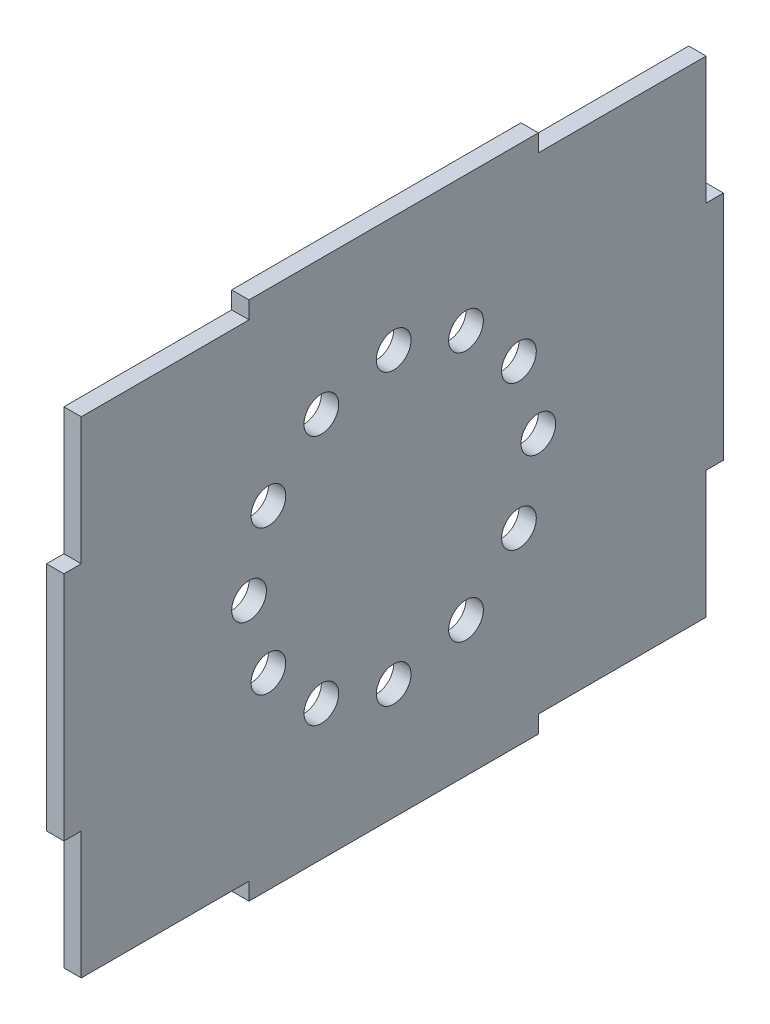
ISO-10303-21;
HEADER;
FILE_DESCRIPTION(('STEP AP214'),'2;1');
FILE_NAME('part.step','',(''),(''),'','','');
FILE_SCHEMA(('AUTOMOTIVE_DESIGN { 1 0 10303 214 1 1 1 1 }'));
ENDSEC;
DATA;
#1=APPLICATION_CONTEXT('core data for automotive mechanical design processes');
#2=APPLICATION_PROTOCOL_DEFINITION('international standard','automotive_design',2000,#1);
#3=PRODUCT_CONTEXT('',#1,'mechanical');
#4=PRODUCT('Part','Part','',(#3));
#5=PRODUCT_RELATED_PRODUCT_CATEGORY('part','',(#4));
#6=PRODUCT_DEFINITION_FORMATION('','',#4);
#7=PRODUCT_DEFINITION_CONTEXT('part definition',#1,'design');
#8=PRODUCT_DEFINITION('design','',#6,#7);
#9=PRODUCT_DEFINITION_SHAPE('','',#8);
#10=(LENGTH_UNIT() NAMED_UNIT(*) SI_UNIT(.MILLI.,.METRE.));
#11=(NAMED_UNIT(*) PLANE_ANGLE_UNIT() SI_UNIT($,.RADIAN.));
#12=(NAMED_UNIT(*) SI_UNIT($,.STERADIAN.) SOLID_ANGLE_UNIT());
#13=UNCERTAINTY_MEASURE_WITH_UNIT(LENGTH_MEASURE(1.E-05),#10,'distance_accuracy_value','');
#14=(GEOMETRIC_REPRESENTATION_CONTEXT(3) GLOBAL_UNCERTAINTY_ASSIGNED_CONTEXT((#13)) GLOBAL_UNIT_ASSIGNED_CONTEXT((#10,
#11,#12)) REPRESENTATION_CONTEXT('',''));
#15=CARTESIAN_POINT('',(0.,0.,0.));
#16=DIRECTION('',(0.,0.,1.));
#17=DIRECTION('',(1.,0.,0.));
#18=AXIS2_PLACEMENT_3D('',#15,#16,#17);
#19=CARTESIAN_POINT('',(3.,3.00000000000002,-82.));
#20=DIRECTION('',(0.,0.,1.));
#21=DIRECTION('',(1.,0.,0.));
#22=AXIS2_PLACEMENT_3D('',#19,#20,#21);
#23=PLANE('',#22);
#24=DIRECTION('',(0.,1.,0.));
#25=VECTOR('',#24,1.);
#26=CARTESIAN_POINT('',(0.,3.00000000000002,-82.));
#27=LINE('',#26,#25);
#28=CARTESIAN_POINT('',(0.,0.,-82.));
#29=VERTEX_POINT('',#28);
#30=CARTESIAN_POINT('',(0.,3.00000000000002,-82.));
#31=VERTEX_POINT('',#30);
#32=EDGE_CURVE('E203',#29,#31,#27,.T.);
#33=ORIENTED_EDGE('',*,*,#32,.T.);
#34=DIRECTION('',(-1.,0.,0.));
#35=VECTOR('',#34,1.);
#36=CARTESIAN_POINT('',(3.,3.00000000000002,-82.));
#37=LINE('',#36,#35);
#38=CARTESIAN_POINT('',(3.,3.00000000000002,-82.));
#39=VERTEX_POINT('',#38);
#40=EDGE_CURVE('E11',#39,#31,#37,.T.);
#41=ORIENTED_EDGE('',*,*,#40,.F.);
#42=DIRECTION('',(0.,1.,0.));
#43=VECTOR('',#42,1.);
#44=CARTESIAN_POINT('',(3.,3.00000000000002,-82.));
#45=LINE('',#44,#43);
#46=CARTESIAN_POINT('',(3.,0.,-82.));
#47=VERTEX_POINT('',#46);
#48=EDGE_CURVE('E242',#47,#39,#45,.T.);
#49=ORIENTED_EDGE('',*,*,#48,.F.);
#50=DIRECTION('',(-1.,0.,0.));
#51=VECTOR('',#50,1.);
#52=CARTESIAN_POINT('',(3.,0.,-82.));
#53=LINE('',#52,#51);
#54=EDGE_CURVE('E199',#47,#29,#53,.T.);
#55=ORIENTED_EDGE('',*,*,#54,.T.);
#56=EDGE_LOOP('',(#33,#41,#49,#55));
#57=FACE_BOUND('',#56,.T.);
#58=ADVANCED_FACE('F35',(#57),#23,.F.);
#59=CARTESIAN_POINT('',(3.,3.00000000000001,-111.));
#60=DIRECTION('',(0.,1.,0.));
#61=DIRECTION('',(0.,0.,1.));
#62=AXIS2_PLACEMENT_3D('',#59,#60,#61);
#63=PLANE('',#62);
#64=DIRECTION('',(0.,0.,-1.));
#65=VECTOR('',#64,1.);
#66=CARTESIAN_POINT('',(0.,3.00000000000001,-111.));
#67=LINE('',#66,#65);
#68=CARTESIAN_POINT('',(0.,3.00000000000001,-111.));
#69=VERTEX_POINT('',#68);
#70=EDGE_CURVE('E206',#31,#69,#67,.T.);
#71=ORIENTED_EDGE('',*,*,#70,.T.);
#72=DIRECTION('',(-1.,0.,0.));
#73=VECTOR('',#72,1.);
#74=CARTESIAN_POINT('',(3.,3.00000000000001,-111.));
#75=LINE('',#74,#73);
#76=CARTESIAN_POINT('',(3.,3.00000000000001,-111.));
#77=VERTEX_POINT('',#76);
#78=EDGE_CURVE('E43',#77,#69,#75,.T.);
#79=ORIENTED_EDGE('',*,*,#78,.F.);
#80=DIRECTION('',(0.,0.,-1.));
#81=VECTOR('',#80,1.);
#82=CARTESIAN_POINT('',(3.,3.00000000000001,-111.));
#83=LINE('',#82,#81);
#84=EDGE_CURVE('E130',#39,#77,#83,.T.);
#85=ORIENTED_EDGE('',*,*,#84,.F.);
#86=ORIENTED_EDGE('',*,*,#40,.T.);
#87=EDGE_LOOP('',(#71,#79,#85,#86));
#88=FACE_BOUND('',#87,.T.);
#89=ADVANCED_FACE('F361',(#88),#63,.F.);
#90=CARTESIAN_POINT('',(3.,25.,-111.));
#91=DIRECTION('',(0.,0.,1.));
#92=DIRECTION('',(1.,0.,0.));
#93=AXIS2_PLACEMENT_3D('',#90,#91,#92);
#94=PLANE('',#93);
#95=DIRECTION('',(0.,1.,0.));
#96=VECTOR('',#95,1.);
#97=CARTESIAN_POINT('',(0.,25.,-111.));
#98=LINE('',#97,#96);
#99=CARTESIAN_POINT('',(0.,25.,-111.));
#100=VERTEX_POINT('',#99);
#101=EDGE_CURVE('E209',#69,#100,#98,.T.);
#102=ORIENTED_EDGE('',*,*,#101,.T.);
#103=DIRECTION('',(-1.,0.,0.));
#104=VECTOR('',#103,1.);
#105=CARTESIAN_POINT('',(3.,25.,-111.));
#106=LINE('',#105,#104);
#107=CARTESIAN_POINT('',(3.,25.,-111.));
#108=VERTEX_POINT('',#107);
#109=EDGE_CURVE('E285',#108,#100,#106,.T.);
#110=ORIENTED_EDGE('',*,*,#109,.F.);
#111=DIRECTION('',(0.,1.,0.));
#112=VECTOR('',#111,1.);
#113=CARTESIAN_POINT('',(3.,25.,-111.));
#114=LINE('',#113,#112);
#115=EDGE_CURVE('E293',#77,#108,#114,.T.);
#116=ORIENTED_EDGE('',*,*,#115,.F.);
#117=ORIENTED_EDGE('',*,*,#78,.T.);
#118=EDGE_LOOP('',(#102,#110,#116,#117));
#119=FACE_BOUND('',#118,.T.);
#120=ADVANCED_FACE('F291',(#119),#94,.F.);
#121=CARTESIAN_POINT('',(3.,25.,-114.));
#122=DIRECTION('',(0.,1.,0.));
#123=DIRECTION('',(0.,0.,1.));
#124=AXIS2_PLACEMENT_3D('',#121,#122,#123);
#125=PLANE('',#124);
#126=DIRECTION('',(0.,0.,-1.));
#127=VECTOR('',#126,1.);
#128=CARTESIAN_POINT('',(0.,25.,-114.));
#129=LINE('',#128,#127);
#130=CARTESIAN_POINT('',(0.,25.,-114.));
#131=VERTEX_POINT('',#130);
#132=EDGE_CURVE('E211',#100,#131,#129,.T.);
#133=ORIENTED_EDGE('',*,*,#132,.T.);
#134=DIRECTION('',(-1.,0.,0.));
#135=VECTOR('',#134,1.);
#136=CARTESIAN_POINT('',(3.,25.,-114.));
#137=LINE('',#136,#135);
#138=CARTESIAN_POINT('',(3.,25.,-114.));
#139=VERTEX_POINT('',#138);
#140=EDGE_CURVE('E282',#139,#131,#137,.T.);
#141=ORIENTED_EDGE('',*,*,#140,.F.);
#142=DIRECTION('',(0.,0.,-1.));
#143=VECTOR('',#142,1.);
#144=CARTESIAN_POINT('',(3.,25.,-114.));
#145=LINE('',#144,#143);
#146=EDGE_CURVE('E311',#108,#139,#145,.T.);
#147=ORIENTED_EDGE('',*,*,#146,.F.);
#148=ORIENTED_EDGE('',*,*,#109,.T.);
#149=EDGE_LOOP('',(#133,#141,#147,#148));
#150=FACE_BOUND('',#149,.T.);
#151=ADVANCED_FACE('F302',(#150),#125,.F.);
#152=CARTESIAN_POINT('',(3.,65.,-114.));
#153=DIRECTION('',(0.,0.,1.));
#154=DIRECTION('',(1.,0.,0.));
#155=AXIS2_PLACEMENT_3D('',#152,#153,#154);
#156=PLANE('',#155);
#157=DIRECTION('',(0.,1.,0.));
#158=VECTOR('',#157,1.);
#159=CARTESIAN_POINT('',(0.,65.,-114.));
#160=LINE('',#159,#158);
#161=CARTESIAN_POINT('',(0.,65.,-114.));
#162=VERTEX_POINT('',#161);
#163=EDGE_CURVE('E213',#131,#162,#160,.T.);
#164=ORIENTED_EDGE('',*,*,#163,.T.);
#165=DIRECTION('',(-1.,0.,0.));
#166=VECTOR('',#165,1.);
#167=CARTESIAN_POINT('',(3.,65.,-114.));
#168=LINE('',#167,#166);
#169=CARTESIAN_POINT('',(3.,65.,-114.));
#170=VERTEX_POINT('',#169);
#171=EDGE_CURVE('E279',#170,#162,#168,.T.);
#172=ORIENTED_EDGE('',*,*,#171,.F.);
#173=DIRECTION('',(0.,1.,0.));
#174=VECTOR('',#173,1.);
#175=CARTESIAN_POINT('',(3.,65.,-114.));
#176=LINE('',#175,#174);
#177=EDGE_CURVE('E308',#139,#170,#176,.T.);
#178=ORIENTED_EDGE('',*,*,#177,.F.);
#179=ORIENTED_EDGE('',*,*,#140,.T.);
#180=EDGE_LOOP('',(#164,#172,#178,#179));
#181=FACE_BOUND('',#180,.T.);
#182=ADVANCED_FACE('F306',(#181),#156,.F.);
#183=CARTESIAN_POINT('',(3.,65.,-114.));
#184=DIRECTION('',(0.,-1.,0.));
#185=DIRECTION('',(0.,0.,-1.));
#186=AXIS2_PLACEMENT_3D('',#183,#184,#185);
#187=PLANE('',#186);
#188=DIRECTION('',(0.,0.,1.));
#189=VECTOR('',#188,1.);
#190=CARTESIAN_POINT('',(0.,65.,-114.));
#191=LINE('',#190,#189);
#192=CARTESIAN_POINT('',(0.,65.,-111.));
#193=VERTEX_POINT('',#192);
#194=EDGE_CURVE('E215',#162,#193,#191,.T.);
#195=ORIENTED_EDGE('',*,*,#194,.T.);
#196=DIRECTION('',(-1.,0.,0.));
#197=VECTOR('',#196,1.);
#198=CARTESIAN_POINT('',(3.,65.,-111.));
#199=LINE('',#198,#197);
#200=CARTESIAN_POINT('',(3.,65.,-111.));
#201=VERTEX_POINT('',#200);
#202=EDGE_CURVE('E276',#201,#193,#199,.T.);
#203=ORIENTED_EDGE('',*,*,#202,.F.);
#204=DIRECTION('',(0.,0.,1.));
#205=VECTOR('',#204,1.);
#206=CARTESIAN_POINT('',(3.,65.,-114.));
#207=LINE('',#206,#205);
#208=EDGE_CURVE('E310',#170,#201,#207,.T.);
#209=ORIENTED_EDGE('',*,*,#208,.F.);
#210=ORIENTED_EDGE('',*,*,#171,.T.);
#211=EDGE_LOOP('',(#195,#203,#209,#210));
#212=FACE_BOUND('',#211,.T.);
#213=ADVANCED_FACE('F374',(#212),#187,.F.);
#214=CARTESIAN_POINT('',(3.,65.,-111.));
#215=DIRECTION('',(0.,0.,1.));
#216=DIRECTION('',(1.,0.,0.));
#217=AXIS2_PLACEMENT_3D('',#214,#215,#216);
#218=PLANE('',#217);
#219=DIRECTION('',(0.,1.,0.));
#220=VECTOR('',#219,1.);
#221=CARTESIAN_POINT('',(0.,65.,-111.));
#222=LINE('',#221,#220);
#223=CARTESIAN_POINT('',(0.,87.,-111.));
#224=VERTEX_POINT('',#223);
#225=EDGE_CURVE('E217',#193,#224,#222,.T.);
#226=ORIENTED_EDGE('',*,*,#225,.T.);
#227=DIRECTION('',(-1.,0.,0.));
#228=VECTOR('',#227,1.);
#229=CARTESIAN_POINT('',(3.,87.,-111.));
#230=LINE('',#229,#228);
#231=CARTESIAN_POINT('',(3.,87.,-111.));
#232=VERTEX_POINT('',#231);
#233=EDGE_CURVE('E273',#232,#224,#230,.T.);
#234=ORIENTED_EDGE('',*,*,#233,.F.);
#235=DIRECTION('',(0.,1.,0.));
#236=VECTOR('',#235,1.);
#237=CARTESIAN_POINT('',(3.,65.,-111.));
#238=LINE('',#237,#236);
#239=EDGE_CURVE('E313',#201,#232,#238,.T.);
#240=ORIENTED_EDGE('',*,*,#239,.F.);
#241=ORIENTED_EDGE('',*,*,#202,.T.);
#242=EDGE_LOOP('',(#226,#234,#240,#241));
#243=FACE_BOUND('',#242,.T.);
#244=ADVANCED_FACE('F377',(#243),#218,.F.);
#245=CARTESIAN_POINT('',(3.,87.,-111.));
#246=DIRECTION('',(0.,-1.,0.));
#247=DIRECTION('',(0.,0.,-1.));
#248=AXIS2_PLACEMENT_3D('',#245,#246,#247);
#249=PLANE('',#248);
#250=DIRECTION('',(0.,0.,1.));
#251=VECTOR('',#250,1.);
#252=CARTESIAN_POINT('',(0.,87.,-111.));
#253=LINE('',#252,#251);
#254=CARTESIAN_POINT('',(0.,87.,-82.));
#255=VERTEX_POINT('',#254);
#256=EDGE_CURVE('E219',#224,#255,#253,.T.);
#257=ORIENTED_EDGE('',*,*,#256,.T.);
#258=DIRECTION('',(-1.,0.,0.));
#259=VECTOR('',#258,1.);
#260=CARTESIAN_POINT('',(3.,87.,-82.));
#261=LINE('',#260,#259);
#262=CARTESIAN_POINT('',(3.,87.,-82.));
#263=VERTEX_POINT('',#262);
#264=EDGE_CURVE('E270',#263,#255,#261,.T.);
#265=ORIENTED_EDGE('',*,*,#264,.F.);
#266=DIRECTION('',(0.,0.,1.));
#267=VECTOR('',#266,1.);
#268=CARTESIAN_POINT('',(3.,87.,-111.));
#269=LINE('',#268,#267);
#270=EDGE_CURVE('E319',#232,#263,#269,.T.);
#271=ORIENTED_EDGE('',*,*,#270,.F.);
#272=ORIENTED_EDGE('',*,*,#233,.T.);
#273=EDGE_LOOP('',(#257,#265,#271,#272));
#274=FACE_BOUND('',#273,.T.);
#275=ADVANCED_FACE('F381',(#274),#249,.F.);
#276=CARTESIAN_POINT('',(3.,87.,-82.));
#277=DIRECTION('',(0.,0.,1.));
#278=DIRECTION('',(1.,0.,0.));
#279=AXIS2_PLACEMENT_3D('',#276,#277,#278);
#280=PLANE('',#279);
#281=DIRECTION('',(0.,1.,0.));
#282=VECTOR('',#281,1.);
#283=CARTESIAN_POINT('',(0.,87.,-82.));
#284=LINE('',#283,#282);
#285=CARTESIAN_POINT('',(0.,90.,-82.));
#286=VERTEX_POINT('',#285);
#287=EDGE_CURVE('E221',#255,#286,#284,.T.);
#288=ORIENTED_EDGE('',*,*,#287,.T.);
#289=DIRECTION('',(-1.,0.,0.));
#290=VECTOR('',#289,1.);
#291=CARTESIAN_POINT('',(3.,90.,-82.));
#292=LINE('',#291,#290);
#293=CARTESIAN_POINT('',(3.,90.,-82.));
#294=VERTEX_POINT('',#293);
#295=EDGE_CURVE('E267',#294,#286,#292,.T.);
#296=ORIENTED_EDGE('',*,*,#295,.F.);
#297=DIRECTION('',(0.,1.,0.));
#298=VECTOR('',#297,1.);
#299=CARTESIAN_POINT('',(3.,87.,-82.));
#300=LINE('',#299,#298);
#301=EDGE_CURVE('E321',#263,#294,#300,.T.);
#302=ORIENTED_EDGE('',*,*,#301,.F.);
#303=ORIENTED_EDGE('',*,*,#264,.T.);
#304=EDGE_LOOP('',(#288,#296,#302,#303));
#305=FACE_BOUND('',#304,.T.);
#306=ADVANCED_FACE('F385',(#305),#280,.F.);
#307=CARTESIAN_POINT('',(3.,89.9999999999999,-32.));
#308=DIRECTION('',(0.,-1.,0.));
#309=DIRECTION('',(0.,0.,-1.));
#310=AXIS2_PLACEMENT_3D('',#307,#308,#309);
#311=PLANE('',#310);
#312=DIRECTION('',(0.,0.,1.));
#313=VECTOR('',#312,1.);
#314=CARTESIAN_POINT('',(0.,89.9999999999999,-32.));
#315=LINE('',#314,#313);
#316=CARTESIAN_POINT('',(0.,89.9999999999999,-32.));
#317=VERTEX_POINT('',#316);
#318=EDGE_CURVE('E223',#286,#317,#315,.T.);
#319=ORIENTED_EDGE('',*,*,#318,.T.);
#320=DIRECTION('',(-1.,0.,0.));
#321=VECTOR('',#320,1.);
#322=CARTESIAN_POINT('',(3.,89.9999999999999,-32.));
#323=LINE('',#322,#321);
#324=CARTESIAN_POINT('',(3.,89.9999999999999,-32.));
#325=VERTEX_POINT('',#324);
#326=EDGE_CURVE('E264',#325,#317,#323,.T.);
#327=ORIENTED_EDGE('',*,*,#326,.F.);
#328=DIRECTION('',(0.,0.,1.));
#329=VECTOR('',#328,1.);
#330=CARTESIAN_POINT('',(3.,89.9999999999999,-32.));
#331=LINE('',#330,#329);
#332=EDGE_CURVE('E323',#294,#325,#331,.T.);
#333=ORIENTED_EDGE('',*,*,#332,.F.);
#334=ORIENTED_EDGE('',*,*,#295,.T.);
#335=EDGE_LOOP('',(#319,#327,#333,#334));
#336=FACE_BOUND('',#335,.T.);
#337=ADVANCED_FACE('F389',(#336),#311,.F.);
#338=CARTESIAN_POINT('',(3.,87.,-32.));
#339=DIRECTION('',(0.,0.,-1.));
#340=DIRECTION('',(0.,1.,0.));
#341=AXIS2_PLACEMENT_3D('',#338,#339,#340);
#342=PLANE('',#341);
#343=DIRECTION('',(0.,-1.,0.));
#344=VECTOR('',#343,1.);
#345=CARTESIAN_POINT('',(0.,87.,-32.));
#346=LINE('',#345,#344);
#347=CARTESIAN_POINT('',(0.,87.,-32.));
#348=VERTEX_POINT('',#347);
#349=EDGE_CURVE('E225',#317,#348,#346,.T.);
#350=ORIENTED_EDGE('',*,*,#349,.T.);
#351=DIRECTION('',(-1.,0.,0.));
#352=VECTOR('',#351,1.);
#353=CARTESIAN_POINT('',(3.,87.,-32.));
#354=LINE('',#353,#352);
#355=CARTESIAN_POINT('',(3.,87.,-32.));
#356=VERTEX_POINT('',#355);
#357=EDGE_CURVE('E261',#356,#348,#354,.T.);
#358=ORIENTED_EDGE('',*,*,#357,.F.);
#359=DIRECTION('',(0.,-1.,0.));
#360=VECTOR('',#359,1.);
#361=CARTESIAN_POINT('',(3.,87.,-32.));
#362=LINE('',#361,#360);
#363=EDGE_CURVE('E325',#325,#356,#362,.T.);
#364=ORIENTED_EDGE('',*,*,#363,.F.);
#365=ORIENTED_EDGE('',*,*,#326,.T.);
#366=EDGE_LOOP('',(#350,#358,#364,#365));
#367=FACE_BOUND('',#366,.T.);
#368=ADVANCED_FACE('F393',(#367),#342,.F.);
#369=CARTESIAN_POINT('',(3.,87.,-2.99999999999999));
#370=DIRECTION('',(0.,-1.,0.));
#371=DIRECTION('',(0.,0.,-1.));
#372=AXIS2_PLACEMENT_3D('',#369,#370,#371);
#373=PLANE('',#372);
#374=DIRECTION('',(0.,0.,1.));
#375=VECTOR('',#374,1.);
#376=CARTESIAN_POINT('',(0.,87.,-2.99999999999999));
#377=LINE('',#376,#375);
#378=CARTESIAN_POINT('',(0.,87.,-2.99999999999999));
#379=VERTEX_POINT('',#378);
#380=EDGE_CURVE('E227',#348,#379,#377,.T.);
#381=ORIENTED_EDGE('',*,*,#380,.T.);
#382=DIRECTION('',(-1.,0.,0.));
#383=VECTOR('',#382,1.);
#384=CARTESIAN_POINT('',(3.,87.,-2.99999999999999));
#385=LINE('',#384,#383);
#386=CARTESIAN_POINT('',(3.,87.,-2.99999999999999));
#387=VERTEX_POINT('',#386);
#388=EDGE_CURVE('E258',#387,#379,#385,.T.);
#389=ORIENTED_EDGE('',*,*,#388,.F.);
#390=DIRECTION('',(0.,0.,1.));
#391=VECTOR('',#390,1.);
#392=CARTESIAN_POINT('',(3.,87.,-2.99999999999999));
#393=LINE('',#392,#391);
#394=EDGE_CURVE('E327',#356,#387,#393,.T.);
#395=ORIENTED_EDGE('',*,*,#394,.F.);
#396=ORIENTED_EDGE('',*,*,#357,.T.);
#397=EDGE_LOOP('',(#381,#389,#395,#396));
#398=FACE_BOUND('',#397,.T.);
#399=ADVANCED_FACE('F397',(#398),#373,.F.);
#400=CARTESIAN_POINT('',(3.,65.,-2.99999999999999));
#401=DIRECTION('',(0.,0.,-1.));
#402=DIRECTION('',(-1.,0.,0.));
#403=AXIS2_PLACEMENT_3D('',#400,#401,#402);
#404=PLANE('',#403);
#405=DIRECTION('',(0.,-1.,0.));
#406=VECTOR('',#405,1.);
#407=CARTESIAN_POINT('',(0.,65.,-2.99999999999999));
#408=LINE('',#407,#406);
#409=CARTESIAN_POINT('',(0.,65.,-2.99999999999999));
#410=VERTEX_POINT('',#409);
#411=EDGE_CURVE('E229',#379,#410,#408,.T.);
#412=ORIENTED_EDGE('',*,*,#411,.T.);
#413=DIRECTION('',(-1.,0.,0.));
#414=VECTOR('',#413,1.);
#415=CARTESIAN_POINT('',(3.,65.,-2.99999999999999));
#416=LINE('',#415,#414);
#417=CARTESIAN_POINT('',(3.,65.,-2.99999999999999));
#418=VERTEX_POINT('',#417);
#419=EDGE_CURVE('E255',#418,#410,#416,.T.);
#420=ORIENTED_EDGE('',*,*,#419,.F.);
#421=DIRECTION('',(0.,-1.,0.));
#422=VECTOR('',#421,1.);
#423=CARTESIAN_POINT('',(3.,65.,-2.99999999999999));
#424=LINE('',#423,#422);
#425=EDGE_CURVE('E329',#387,#418,#424,.T.);
#426=ORIENTED_EDGE('',*,*,#425,.F.);
#427=ORIENTED_EDGE('',*,*,#388,.T.);
#428=EDGE_LOOP('',(#412,#420,#426,#427));
#429=FACE_BOUND('',#428,.T.);
#430=ADVANCED_FACE('F401',(#429),#404,.F.);
#431=CARTESIAN_POINT('',(3.,65.,0.));
#432=DIRECTION('',(0.,-1.,0.));
#433=DIRECTION('',(0.,0.,-1.));
#434=AXIS2_PLACEMENT_3D('',#431,#432,#433);
#435=PLANE('',#434);
#436=DIRECTION('',(0.,0.,1.));
#437=VECTOR('',#436,1.);
#438=CARTESIAN_POINT('',(0.,65.,0.));
#439=LINE('',#438,#437);
#440=CARTESIAN_POINT('',(0.,65.,0.));
#441=VERTEX_POINT('',#440);
#442=EDGE_CURVE('E231',#410,#441,#439,.T.);
#443=ORIENTED_EDGE('',*,*,#442,.T.);
#444=DIRECTION('',(-1.,0.,0.));
#445=VECTOR('',#444,1.);
#446=CARTESIAN_POINT('',(3.,65.,0.));
#447=LINE('',#446,#445);
#448=CARTESIAN_POINT('',(3.,65.,0.));
#449=VERTEX_POINT('',#448);
#450=EDGE_CURVE('E252',#449,#441,#447,.T.);
#451=ORIENTED_EDGE('',*,*,#450,.F.);
#452=DIRECTION('',(0.,0.,1.));
#453=VECTOR('',#452,1.);
#454=CARTESIAN_POINT('',(3.,65.,0.));
#455=LINE('',#454,#453);
#456=EDGE_CURVE('E331',#418,#449,#455,.T.);
#457=ORIENTED_EDGE('',*,*,#456,.F.);
#458=ORIENTED_EDGE('',*,*,#419,.T.);
#459=EDGE_LOOP('',(#443,#451,#457,#458));
#460=FACE_BOUND('',#459,.T.);
#461=ADVANCED_FACE('F405',(#460),#435,.F.);
#462=CARTESIAN_POINT('',(3.,65.,0.));
#463=DIRECTION('',(0.,0.,-1.));
#464=DIRECTION('',(0.,1.,0.));
#465=AXIS2_PLACEMENT_3D('',#462,#463,#464);
#466=PLANE('',#465);
#467=DIRECTION('',(0.,-1.,0.));
#468=VECTOR('',#467,1.);
#469=CARTESIAN_POINT('',(0.,65.,0.));
#470=LINE('',#469,#468);
#471=CARTESIAN_POINT('',(0.,25.,0.));
#472=VERTEX_POINT('',#471);
#473=EDGE_CURVE('E233',#441,#472,#470,.T.);
#474=ORIENTED_EDGE('',*,*,#473,.T.);
#475=DIRECTION('',(-1.,0.,0.));
#476=VECTOR('',#475,1.);
#477=CARTESIAN_POINT('',(3.,25.,0.));
#478=LINE('',#477,#476);
#479=CARTESIAN_POINT('',(3.,25.,0.));
#480=VERTEX_POINT('',#479);
#481=EDGE_CURVE('E249',#480,#472,#478,.T.);
#482=ORIENTED_EDGE('',*,*,#481,.F.);
#483=DIRECTION('',(0.,-1.,0.));
#484=VECTOR('',#483,1.);
#485=CARTESIAN_POINT('',(3.,65.,0.));
#486=LINE('',#485,#484);
#487=EDGE_CURVE('E333',#449,#480,#486,.T.);
#488=ORIENTED_EDGE('',*,*,#487,.F.);
#489=ORIENTED_EDGE('',*,*,#450,.T.);
#490=EDGE_LOOP('',(#474,#482,#488,#489));
#491=FACE_BOUND('',#490,.T.);
#492=ADVANCED_FACE('F409',(#491),#466,.F.);
#493=CARTESIAN_POINT('',(3.,25.,0.));
#494=DIRECTION('',(0.,1.,0.));
#495=DIRECTION('',(0.,0.,1.));
#496=AXIS2_PLACEMENT_3D('',#493,#494,#495);
#497=PLANE('',#496);
#498=DIRECTION('',(0.,0.,-1.));
#499=VECTOR('',#498,1.);
#500=CARTESIAN_POINT('',(0.,25.,0.));
#501=LINE('',#500,#499);
#502=CARTESIAN_POINT('',(0.,25.,-3.));
#503=VERTEX_POINT('',#502);
#504=EDGE_CURVE('E235',#472,#503,#501,.T.);
#505=ORIENTED_EDGE('',*,*,#504,.T.);
#506=DIRECTION('',(-1.,0.,0.));
#507=VECTOR('',#506,1.);
#508=CARTESIAN_POINT('',(3.,25.,-3.));
#509=LINE('',#508,#507);
#510=CARTESIAN_POINT('',(3.,25.,-3.));
#511=VERTEX_POINT('',#510);
#512=EDGE_CURVE('E246',#511,#503,#509,.T.);
#513=ORIENTED_EDGE('',*,*,#512,.F.);
#514=DIRECTION('',(0.,0.,-1.));
#515=VECTOR('',#514,1.);
#516=CARTESIAN_POINT('',(3.,25.,0.));
#517=LINE('',#516,#515);
#518=EDGE_CURVE('E335',#480,#511,#517,.T.);
#519=ORIENTED_EDGE('',*,*,#518,.F.);
#520=ORIENTED_EDGE('',*,*,#481,.T.);
#521=EDGE_LOOP('',(#505,#513,#519,#520));
#522=FACE_BOUND('',#521,.T.);
#523=ADVANCED_FACE('F341',(#522),#497,.F.);
#524=CARTESIAN_POINT('',(3.,25.,-3.));
#525=DIRECTION('',(0.,0.,-1.));
#526=DIRECTION('',(0.,1.,0.));
#527=AXIS2_PLACEMENT_3D('',#524,#525,#526);
#528=PLANE('',#527);
#529=DIRECTION('',(0.,-1.,0.));
#530=VECTOR('',#529,1.);
#531=CARTESIAN_POINT('',(0.,25.,-3.));
#532=LINE('',#531,#530);
#533=CARTESIAN_POINT('',(0.,3.,-3.00000000000001));
#534=VERTEX_POINT('',#533);
#535=EDGE_CURVE('E237',#503,#534,#532,.T.);
#536=ORIENTED_EDGE('',*,*,#535,.T.);
#537=DIRECTION('',(-1.,0.,0.));
#538=VECTOR('',#537,1.);
#539=CARTESIAN_POINT('',(3.,3.,-3.00000000000001));
#540=LINE('',#539,#538);
#541=CARTESIAN_POINT('',(3.,3.,-3.00000000000001));
#542=VERTEX_POINT('',#541);
#543=EDGE_CURVE('E194',#542,#534,#540,.T.);
#544=ORIENTED_EDGE('',*,*,#543,.F.);
#545=DIRECTION('',(0.,-1.,0.));
#546=VECTOR('',#545,1.);
#547=CARTESIAN_POINT('',(3.,25.,-3.));
#548=LINE('',#547,#546);
#549=EDGE_CURVE('E185',#511,#542,#548,.T.);
#550=ORIENTED_EDGE('',*,*,#549,.F.);
#551=ORIENTED_EDGE('',*,*,#512,.T.);
#552=EDGE_LOOP('',(#536,#544,#550,#551));
#553=FACE_BOUND('',#552,.T.);
#554=ADVANCED_FACE('F345',(#553),#528,.F.);
#555=CARTESIAN_POINT('',(3.,3.,-3.00000000000001));
#556=DIRECTION('',(0.,1.,0.));
#557=DIRECTION('',(0.,0.,1.));
#558=AXIS2_PLACEMENT_3D('',#555,#556,#557);
#559=PLANE('',#558);
#560=DIRECTION('',(0.,0.,-1.));
#561=VECTOR('',#560,1.);
#562=CARTESIAN_POINT('',(0.,3.,-3.00000000000001));
#563=LINE('',#562,#561);
#564=CARTESIAN_POINT('',(0.,3.00000000000002,-32.));
#565=VERTEX_POINT('',#564);
#566=EDGE_CURVE('E193',#534,#565,#563,.T.);
#567=ORIENTED_EDGE('',*,*,#566,.T.);
#568=DIRECTION('',(-1.,0.,0.));
#569=VECTOR('',#568,1.);
#570=CARTESIAN_POINT('',(3.,3.00000000000002,-32.));
#571=LINE('',#570,#569);
#572=CARTESIAN_POINT('',(3.,3.00000000000002,-32.));
#573=VERTEX_POINT('',#572);
#574=EDGE_CURVE('E190',#573,#565,#571,.T.);
#575=ORIENTED_EDGE('',*,*,#574,.F.);
#576=DIRECTION('',(0.,0.,-1.));
#577=VECTOR('',#576,1.);
#578=CARTESIAN_POINT('',(3.,3.,-3.00000000000001));
#579=LINE('',#578,#577);
#580=EDGE_CURVE('E179',#542,#573,#579,.T.);
#581=ORIENTED_EDGE('',*,*,#580,.F.);
#582=ORIENTED_EDGE('',*,*,#543,.T.);
#583=EDGE_LOOP('',(#567,#575,#581,#582));
#584=FACE_BOUND('',#583,.T.);
#585=ADVANCED_FACE('F191',(#584),#559,.F.);
#586=CARTESIAN_POINT('',(3.,3.00000000000002,-32.));
#587=DIRECTION('',(0.,0.,-1.));
#588=DIRECTION('',(-1.,0.,0.));
#589=AXIS2_PLACEMENT_3D('',#586,#587,#588);
#590=PLANE('',#589);
#591=DIRECTION('',(0.,-1.,0.));
#592=VECTOR('',#591,1.);
#593=CARTESIAN_POINT('',(0.,3.00000000000002,-32.));
#594=LINE('',#593,#592);
#595=CARTESIAN_POINT('',(0.,0.,-32.));
#596=VERTEX_POINT('',#595);
#597=EDGE_CURVE('E116',#565,#596,#594,.T.);
#598=ORIENTED_EDGE('',*,*,#597,.T.);
#599=DIRECTION('',(-1.,0.,0.));
#600=VECTOR('',#599,1.);
#601=CARTESIAN_POINT('',(3.,0.,-32.));
#602=LINE('',#601,#600);
#603=CARTESIAN_POINT('',(3.,0.,-32.));
#604=VERTEX_POINT('',#603);
#605=EDGE_CURVE('E195',#604,#596,#602,.T.);
#606=ORIENTED_EDGE('',*,*,#605,.F.);
#607=DIRECTION('',(0.,-1.,0.));
#608=VECTOR('',#607,1.);
#609=CARTESIAN_POINT('',(3.,3.00000000000002,-32.));
#610=LINE('',#609,#608);
#611=EDGE_CURVE('E183',#573,#604,#610,.T.);
#612=ORIENTED_EDGE('',*,*,#611,.F.);
#613=ORIENTED_EDGE('',*,*,#574,.T.);
#614=EDGE_LOOP('',(#598,#606,#612,#613));
#615=FACE_BOUND('',#614,.T.);
#616=ADVANCED_FACE('F197',(#615),#590,.F.);
#617=CARTESIAN_POINT('',(3.,0.,-32.));
#618=DIRECTION('',(0.,1.,0.));
#619=DIRECTION('',(0.,0.,1.));
#620=AXIS2_PLACEMENT_3D('',#617,#618,#619);
#621=PLANE('',#620);
#622=DIRECTION('',(0.,0.,-1.));
#623=VECTOR('',#622,1.);
#624=CARTESIAN_POINT('',(0.,0.,-32.));
#625=LINE('',#624,#623);
#626=EDGE_CURVE('E122',#596,#29,#625,.T.);
#627=ORIENTED_EDGE('',*,*,#626,.T.);
#628=ORIENTED_EDGE('',*,*,#54,.F.);
#629=DIRECTION('',(0.,0.,-1.));
#630=VECTOR('',#629,1.);
#631=CARTESIAN_POINT('',(3.,0.,-32.));
#632=LINE('',#631,#630);
#633=EDGE_CURVE('E51',#604,#47,#632,.T.);
#634=ORIENTED_EDGE('',*,*,#633,.F.);
#635=ORIENTED_EDGE('',*,*,#605,.T.);
#636=EDGE_LOOP('',(#627,#628,#634,#635));
#637=FACE_BOUND('',#636,.T.);
#638=ADVANCED_FACE('F349',(#637),#621,.F.);
#639=CARTESIAN_POINT('',(3.,0.,0.));
#640=DIRECTION('',(1.,0.,0.));
#641=DIRECTION('',(0.,0.,-1.));
#642=AXIS2_PLACEMENT_3D('',#639,#640,#641);
#643=PLANE('',#642);
#644=CARTESIAN_POINT('',(3.,23.3493649053889,-69.4999999999998));
#645=DIRECTION('',(1.,0.,0.));
#646=DIRECTION('',(0.,0.,-1.));
#647=AXIS2_PLACEMENT_3D('',#644,#645,#646);
#648=CIRCLE('',#647,3.00000000000001);
#649=CARTESIAN_POINT('',(3.,23.3493649053889,-72.4999999999998));
#650=VERTEX_POINT('',#649);
#651=EDGE_CURVE('E575',#650,#650,#648,.T.);
#652=ORIENTED_EDGE('',*,*,#651,.F.);
#653=EDGE_LOOP('',(#652));
#654=FACE_BOUND('',#653,.T.);
#655=CARTESIAN_POINT('',(3.,32.4999999999998,-78.6506350946109));
#656=DIRECTION('',(1.,0.,0.));
#657=DIRECTION('',(0.,0.,-1.));
#658=AXIS2_PLACEMENT_3D('',#655,#656,#657);
#659=CIRCLE('',#658,3.);
#660=CARTESIAN_POINT('',(3.,32.4999999999998,-81.6506350946109));
#661=VERTEX_POINT('',#660);
#662=EDGE_CURVE('E578',#661,#661,#659,.T.);
#663=ORIENTED_EDGE('',*,*,#662,.F.);
#664=EDGE_LOOP('',(#663));
#665=FACE_BOUND('',#664,.T.);
#666=CARTESIAN_POINT('',(3.,44.9999999999998,-82.));
#667=DIRECTION('',(1.,0.,0.));
#668=DIRECTION('',(0.,0.,-1.));
#669=AXIS2_PLACEMENT_3D('',#666,#667,#668);
#670=CIRCLE('',#669,3.00000000000002);
#671=CARTESIAN_POINT('',(3.,44.9999999999998,-85.));
#672=VERTEX_POINT('',#671);
#673=EDGE_CURVE('E637',#672,#672,#670,.T.);
#674=ORIENTED_EDGE('',*,*,#673,.F.);
#675=EDGE_LOOP('',(#674));
#676=FACE_BOUND('',#675,.T.);
#677=CARTESIAN_POINT('',(3.,57.4999999999999,-78.650635094611));
#678=DIRECTION('',(1.,0.,0.));
#679=DIRECTION('',(0.,0.,-1.));
#680=AXIS2_PLACEMENT_3D('',#677,#678,#679);
#681=CIRCLE('',#680,3.);
#682=CARTESIAN_POINT('',(3.,57.4999999999999,-81.650635094611));
#683=VERTEX_POINT('',#682);
#684=EDGE_CURVE('E624',#683,#683,#681,.T.);
#685=ORIENTED_EDGE('',*,*,#684,.F.);
#686=EDGE_LOOP('',(#685));
#687=FACE_BOUND('',#686,.T.);
#688=CARTESIAN_POINT('',(3.,66.6506350946109,-69.5000000000001));
#689=DIRECTION('',(1.,0.,0.));
#690=DIRECTION('',(0.,0.,-1.));
#691=AXIS2_PLACEMENT_3D('',#688,#689,#690);
#692=CIRCLE('',#691,3.);
#693=CARTESIAN_POINT('',(3.,66.6506350946109,-72.5000000000001));
#694=VERTEX_POINT('',#693);
#695=EDGE_CURVE('E607',#694,#694,#692,.T.);
#696=ORIENTED_EDGE('',*,*,#695,.F.);
#697=EDGE_LOOP('',(#696));
#698=FACE_BOUND('',#697,.T.);
#699=CARTESIAN_POINT('',(3.,70.,-57.0000000000001));
#700=DIRECTION('',(1.,0.,0.));
#701=DIRECTION('',(0.,0.,-1.));
#702=AXIS2_PLACEMENT_3D('',#699,#700,#701);
#703=CIRCLE('',#702,2.99999999999999);
#704=CARTESIAN_POINT('',(3.,70.,-60.0000000000001));
#705=VERTEX_POINT('',#704);
#706=EDGE_CURVE('E601',#705,#705,#703,.T.);
#707=ORIENTED_EDGE('',*,*,#706,.F.);
#708=EDGE_LOOP('',(#707));
#709=FACE_BOUND('',#708,.T.);
#710=CARTESIAN_POINT('',(3.,66.650635094611,-44.5));
#711=DIRECTION('',(1.,0.,0.));
#712=DIRECTION('',(0.,0.,-1.));
#713=AXIS2_PLACEMENT_3D('',#710,#711,#712);
#714=CIRCLE('',#713,2.99999999999999);
#715=CARTESIAN_POINT('',(3.,66.650635094611,-47.5));
#716=VERTEX_POINT('',#715);
#717=EDGE_CURVE('E595',#716,#716,#714,.T.);
#718=ORIENTED_EDGE('',*,*,#717,.F.);
#719=EDGE_LOOP('',(#718));
#720=FACE_BOUND('',#719,.T.);
#721=CARTESIAN_POINT('',(3.,57.5,-35.349364905389));
#722=DIRECTION('',(1.,0.,0.));
#723=DIRECTION('',(0.,0.,-1.));
#724=AXIS2_PLACEMENT_3D('',#721,#722,#723);
#725=CIRCLE('',#724,3.);
#726=CARTESIAN_POINT('',(3.,57.5,-38.349364905389));
#727=VERTEX_POINT('',#726);
#728=EDGE_CURVE('E589',#727,#727,#725,.T.);
#729=ORIENTED_EDGE('',*,*,#728,.F.);
#730=EDGE_LOOP('',(#729));
#731=FACE_BOUND('',#730,.T.);
#732=CARTESIAN_POINT('',(3.,20.,-56.9999999999997));
#733=DIRECTION('',(1.,0.,0.));
#734=DIRECTION('',(0.,0.,-1.));
#735=AXIS2_PLACEMENT_3D('',#732,#733,#734);
#736=CIRCLE('',#735,3.);
#737=CARTESIAN_POINT('',(3.,20.,-59.9999999999997));
#738=VERTEX_POINT('',#737);
#739=EDGE_CURVE('E581',#738,#738,#736,.T.);
#740=ORIENTED_EDGE('',*,*,#739,.F.);
#741=EDGE_LOOP('',(#740));
#742=FACE_BOUND('',#741,.T.);
#743=CARTESIAN_POINT('',(3.,23.3493649053892,-44.4999999999997));
#744=DIRECTION('',(1.,0.,0.));
#745=DIRECTION('',(0.,0.,-1.));
#746=AXIS2_PLACEMENT_3D('',#743,#744,#745);
#747=CIRCLE('',#746,3.00000000000001);
#748=CARTESIAN_POINT('',(3.,23.3493649053892,-47.4999999999997));
#749=VERTEX_POINT('',#748);
#750=EDGE_CURVE('E664',#749,#749,#747,.T.);
#751=ORIENTED_EDGE('',*,*,#750,.F.);
#752=EDGE_LOOP('',(#751));
#753=FACE_BOUND('',#752,.T.);
#754=CARTESIAN_POINT('',(3.,32.5000000000003,-35.3493649053889));
#755=DIRECTION('',(1.,0.,0.));
#756=DIRECTION('',(0.,0.,-1.));
#757=AXIS2_PLACEMENT_3D('',#754,#755,#756);
#758=CIRCLE('',#757,3.);
#759=CARTESIAN_POINT('',(3.,32.5000000000003,-38.3493649053889));
#760=VERTEX_POINT('',#759);
#761=EDGE_CURVE('E632',#760,#760,#758,.T.);
#762=ORIENTED_EDGE('',*,*,#761,.F.);
#763=EDGE_LOOP('',(#762));
#764=FACE_BOUND('',#763,.T.);
#765=CARTESIAN_POINT('',(3.,45.,-32.));
#766=DIRECTION('',(1.,0.,0.));
#767=DIRECTION('',(0.,0.,-1.));
#768=AXIS2_PLACEMENT_3D('',#765,#766,#767);
#769=CIRCLE('',#768,3.);
#770=CARTESIAN_POINT('',(3.,45.,-35.));
#771=VERTEX_POINT('',#770);
#772=EDGE_CURVE('E588',#771,#771,#769,.T.);
#773=ORIENTED_EDGE('',*,*,#772,.F.);
#774=EDGE_LOOP('',(#773));
#775=FACE_BOUND('',#774,.T.);
#776=ORIENTED_EDGE('',*,*,#48,.T.);
#777=ORIENTED_EDGE('',*,*,#84,.T.);
#778=ORIENTED_EDGE('',*,*,#115,.T.);
#779=ORIENTED_EDGE('',*,*,#146,.T.);
#780=ORIENTED_EDGE('',*,*,#177,.T.);
#781=ORIENTED_EDGE('',*,*,#208,.T.);
#782=ORIENTED_EDGE('',*,*,#239,.T.);
#783=ORIENTED_EDGE('',*,*,#270,.T.);
#784=ORIENTED_EDGE('',*,*,#301,.T.);
#785=ORIENTED_EDGE('',*,*,#332,.T.);
#786=ORIENTED_EDGE('',*,*,#363,.T.);
#787=ORIENTED_EDGE('',*,*,#394,.T.);
#788=ORIENTED_EDGE('',*,*,#425,.T.);
#789=ORIENTED_EDGE('',*,*,#456,.T.);
#790=ORIENTED_EDGE('',*,*,#487,.T.);
#791=ORIENTED_EDGE('',*,*,#518,.T.);
#792=ORIENTED_EDGE('',*,*,#549,.T.);
#793=ORIENTED_EDGE('',*,*,#580,.T.);
#794=ORIENTED_EDGE('',*,*,#611,.T.);
#795=ORIENTED_EDGE('',*,*,#633,.T.);
#796=EDGE_LOOP('',(#776,#777,#778,#779,#780,#781,#782,#783,#784,#785,#786,#787,#788,#789,#790,
#791,#792,#793,#794,#795));
#797=FACE_BOUND('',#796,.T.);
#798=ADVANCED_FACE('F181',(#654,#665,#676,#687,#698,#709,#720,#731,#742,#753,#764,#775,#797),
#643,.T.);
#799=CARTESIAN_POINT('',(0.,0.,0.));
#800=DIRECTION('',(1.,0.,0.));
#801=DIRECTION('',(0.,0.,-1.));
#802=AXIS2_PLACEMENT_3D('',#799,#800,#801);
#803=PLANE('',#802);
#804=CARTESIAN_POINT('',(0.,23.3493649053889,-69.4999999999998));
#805=DIRECTION('',(1.,0.,0.));
#806=DIRECTION('',(0.,0.,-1.));
#807=AXIS2_PLACEMENT_3D('',#804,#805,#806);
#808=CIRCLE('',#807,3.00000000000001);
#809=CARTESIAN_POINT('',(0.,23.3493649053889,-72.4999999999998));
#810=VERTEX_POINT('',#809);
#811=EDGE_CURVE('E572',#810,#810,#808,.T.);
#812=ORIENTED_EDGE('',*,*,#811,.T.);
#813=EDGE_LOOP('',(#812));
#814=FACE_BOUND('',#813,.T.);
#815=CARTESIAN_POINT('',(0.,32.4999999999998,-78.6506350946109));
#816=DIRECTION('',(1.,0.,0.));
#817=DIRECTION('',(0.,0.,-1.));
#818=AXIS2_PLACEMENT_3D('',#815,#816,#817);
#819=CIRCLE('',#818,3.);
#820=CARTESIAN_POINT('',(0.,32.4999999999998,-81.6506350946109));
#821=VERTEX_POINT('',#820);
#822=EDGE_CURVE('E640',#821,#821,#819,.T.);
#823=ORIENTED_EDGE('',*,*,#822,.T.);
#824=EDGE_LOOP('',(#823));
#825=FACE_BOUND('',#824,.T.);
#826=CARTESIAN_POINT('',(0.,44.9999999999998,-82.));
#827=DIRECTION('',(1.,0.,0.));
#828=DIRECTION('',(0.,0.,-1.));
#829=AXIS2_PLACEMENT_3D('',#826,#827,#828);
#830=CIRCLE('',#829,3.00000000000002);
#831=CARTESIAN_POINT('',(0.,44.9999999999998,-85.));
#832=VERTEX_POINT('',#831);
#833=EDGE_CURVE('E629',#832,#832,#830,.T.);
#834=ORIENTED_EDGE('',*,*,#833,.T.);
#835=EDGE_LOOP('',(#834));
#836=FACE_BOUND('',#835,.T.);
#837=CARTESIAN_POINT('',(0.,57.4999999999999,-78.650635094611));
#838=DIRECTION('',(1.,0.,0.));
#839=DIRECTION('',(0.,0.,-1.));
#840=AXIS2_PLACEMENT_3D('',#837,#838,#839);
#841=CIRCLE('',#840,3.);
#842=CARTESIAN_POINT('',(0.,57.4999999999999,-81.650635094611));
#843=VERTEX_POINT('',#842);
#844=EDGE_CURVE('E610',#843,#843,#841,.T.);
#845=ORIENTED_EDGE('',*,*,#844,.T.);
#846=EDGE_LOOP('',(#845));
#847=FACE_BOUND('',#846,.T.);
#848=CARTESIAN_POINT('',(0.,66.6506350946109,-69.5000000000001));
#849=DIRECTION('',(1.,0.,0.));
#850=DIRECTION('',(0.,0.,-1.));
#851=AXIS2_PLACEMENT_3D('',#848,#849,#850);
#852=CIRCLE('',#851,3.);
#853=CARTESIAN_POINT('',(0.,66.6506350946109,-72.5000000000001));
#854=VERTEX_POINT('',#853);
#855=EDGE_CURVE('E604',#854,#854,#852,.T.);
#856=ORIENTED_EDGE('',*,*,#855,.T.);
#857=EDGE_LOOP('',(#856));
#858=FACE_BOUND('',#857,.T.);
#859=CARTESIAN_POINT('',(0.,70.,-57.0000000000001));
#860=DIRECTION('',(1.,0.,0.));
#861=DIRECTION('',(0.,0.,-1.));
#862=AXIS2_PLACEMENT_3D('',#859,#860,#861);
#863=CIRCLE('',#862,2.99999999999999);
#864=CARTESIAN_POINT('',(0.,70.,-60.0000000000001));
#865=VERTEX_POINT('',#864);
#866=EDGE_CURVE('E598',#865,#865,#863,.T.);
#867=ORIENTED_EDGE('',*,*,#866,.T.);
#868=EDGE_LOOP('',(#867));
#869=FACE_BOUND('',#868,.T.);
#870=CARTESIAN_POINT('',(0.,66.650635094611,-44.5));
#871=DIRECTION('',(1.,0.,0.));
#872=DIRECTION('',(0.,0.,-1.));
#873=AXIS2_PLACEMENT_3D('',#870,#871,#872);
#874=CIRCLE('',#873,2.99999999999999);
#875=CARTESIAN_POINT('',(0.,66.650635094611,-47.5));
#876=VERTEX_POINT('',#875);
#877=EDGE_CURVE('E592',#876,#876,#874,.T.);
#878=ORIENTED_EDGE('',*,*,#877,.T.);
#879=EDGE_LOOP('',(#878));
#880=FACE_BOUND('',#879,.T.);
#881=CARTESIAN_POINT('',(0.,57.5,-35.349364905389));
#882=DIRECTION('',(1.,0.,0.));
#883=DIRECTION('',(0.,0.,-1.));
#884=AXIS2_PLACEMENT_3D('',#881,#882,#883);
#885=CIRCLE('',#884,3.);
#886=CARTESIAN_POINT('',(0.,57.5,-38.349364905389));
#887=VERTEX_POINT('',#886);
#888=EDGE_CURVE('E585',#887,#887,#885,.T.);
#889=ORIENTED_EDGE('',*,*,#888,.T.);
#890=EDGE_LOOP('',(#889));
#891=FACE_BOUND('',#890,.T.);
#892=CARTESIAN_POINT('',(0.,20.,-56.9999999999997));
#893=DIRECTION('',(1.,0.,0.));
#894=DIRECTION('',(0.,0.,-1.));
#895=AXIS2_PLACEMENT_3D('',#892,#893,#894);
#896=CIRCLE('',#895,3.);
#897=CARTESIAN_POINT('',(0.,20.,-59.9999999999997));
#898=VERTEX_POINT('',#897);
#899=EDGE_CURVE('E576',#898,#898,#896,.T.);
#900=ORIENTED_EDGE('',*,*,#899,.T.);
#901=EDGE_LOOP('',(#900));
#902=FACE_BOUND('',#901,.T.);
#903=CARTESIAN_POINT('',(0.,23.3493649053892,-44.4999999999997));
#904=DIRECTION('',(1.,0.,0.));
#905=DIRECTION('',(0.,0.,-1.));
#906=AXIS2_PLACEMENT_3D('',#903,#904,#905);
#907=CIRCLE('',#906,3.00000000000001);
#908=CARTESIAN_POINT('',(0.,23.3493649053892,-47.4999999999997));
#909=VERTEX_POINT('',#908);
#910=EDGE_CURVE('E672',#909,#909,#907,.T.);
#911=ORIENTED_EDGE('',*,*,#910,.T.);
#912=EDGE_LOOP('',(#911));
#913=FACE_BOUND('',#912,.T.);
#914=CARTESIAN_POINT('',(0.,32.5000000000003,-35.3493649053889));
#915=DIRECTION('',(1.,0.,0.));
#916=DIRECTION('',(0.,0.,-1.));
#917=AXIS2_PLACEMENT_3D('',#914,#915,#916);
#918=CIRCLE('',#917,3.);
#919=CARTESIAN_POINT('',(0.,32.5000000000003,-38.3493649053889));
#920=VERTEX_POINT('',#919);
#921=EDGE_CURVE('E668',#920,#920,#918,.T.);
#922=ORIENTED_EDGE('',*,*,#921,.T.);
#923=EDGE_LOOP('',(#922));
#924=FACE_BOUND('',#923,.T.);
#925=CARTESIAN_POINT('',(0.,45.,-32.));
#926=DIRECTION('',(1.,0.,0.));
#927=DIRECTION('',(0.,0.,-1.));
#928=AXIS2_PLACEMENT_3D('',#925,#926,#927);
#929=CIRCLE('',#928,3.);
#930=CARTESIAN_POINT('',(0.,45.,-35.));
#931=VERTEX_POINT('',#930);
#932=EDGE_CURVE('E207',#931,#931,#929,.T.);
#933=ORIENTED_EDGE('',*,*,#932,.T.);
#934=EDGE_LOOP('',(#933));
#935=FACE_BOUND('',#934,.T.);
#936=ORIENTED_EDGE('',*,*,#32,.F.);
#937=ORIENTED_EDGE('',*,*,#626,.F.);
#938=ORIENTED_EDGE('',*,*,#597,.F.);
#939=ORIENTED_EDGE('',*,*,#566,.F.);
#940=ORIENTED_EDGE('',*,*,#535,.F.);
#941=ORIENTED_EDGE('',*,*,#504,.F.);
#942=ORIENTED_EDGE('',*,*,#473,.F.);
#943=ORIENTED_EDGE('',*,*,#442,.F.);
#944=ORIENTED_EDGE('',*,*,#411,.F.);
#945=ORIENTED_EDGE('',*,*,#380,.F.);
#946=ORIENTED_EDGE('',*,*,#349,.F.);
#947=ORIENTED_EDGE('',*,*,#318,.F.);
#948=ORIENTED_EDGE('',*,*,#287,.F.);
#949=ORIENTED_EDGE('',*,*,#256,.F.);
#950=ORIENTED_EDGE('',*,*,#225,.F.);
#951=ORIENTED_EDGE('',*,*,#194,.F.);
#952=ORIENTED_EDGE('',*,*,#163,.F.);
#953=ORIENTED_EDGE('',*,*,#132,.F.);
#954=ORIENTED_EDGE('',*,*,#101,.F.);
#955=ORIENTED_EDGE('',*,*,#70,.F.);
#956=EDGE_LOOP('',(#936,#937,#938,#939,#940,#941,#942,#943,#944,#945,#946,#947,#948,#949,#950,
#951,#952,#953,#954,#955));
#957=FACE_BOUND('',#956,.T.);
#958=ADVANCED_FACE('F297',(#814,#825,#836,#847,#858,#869,#880,#891,#902,#913,#924,#935,#957),
#803,.F.);
#959=CARTESIAN_POINT('',(0.,45.,-32.));
#960=DIRECTION('',(1.,0.,0.));
#961=DIRECTION('',(0.,0.,-1.));
#962=AXIS2_PLACEMENT_3D('',#959,#960,#961);
#963=CYLINDRICAL_SURFACE('',#962,3.);
#964=ORIENTED_EDGE('',*,*,#932,.F.);
#965=EDGE_LOOP('',(#964));
#966=FACE_BOUND('',#965,.T.);
#967=ORIENTED_EDGE('',*,*,#772,.T.);
#968=EDGE_LOOP('',(#967));
#969=FACE_BOUND('',#968,.T.);
#970=ADVANCED_FACE('F446',(#966,#969),#963,.F.);
#971=CARTESIAN_POINT('',(0.,32.5000000000003,-35.3493649053889));
#972=DIRECTION('',(1.,0.,0.));
#973=DIRECTION('',(0.,0.,-1.));
#974=AXIS2_PLACEMENT_3D('',#971,#972,#973);
#975=CYLINDRICAL_SURFACE('',#974,3.);
#976=ORIENTED_EDGE('',*,*,#921,.F.);
#977=EDGE_LOOP('',(#976));
#978=FACE_BOUND('',#977,.T.);
#979=ORIENTED_EDGE('',*,*,#761,.T.);
#980=EDGE_LOOP('',(#979));
#981=FACE_BOUND('',#980,.T.);
#982=ADVANCED_FACE('F455',(#978,#981),#975,.F.);
#983=CARTESIAN_POINT('',(0.,23.3493649053892,-44.4999999999997));
#984=DIRECTION('',(1.,0.,0.));
#985=DIRECTION('',(0.,0.,-1.));
#986=AXIS2_PLACEMENT_3D('',#983,#984,#985);
#987=CYLINDRICAL_SURFACE('',#986,3.00000000000001);
#988=ORIENTED_EDGE('',*,*,#910,.F.);
#989=EDGE_LOOP('',(#988));
#990=FACE_BOUND('',#989,.T.);
#991=ORIENTED_EDGE('',*,*,#750,.T.);
#992=EDGE_LOOP('',(#991));
#993=FACE_BOUND('',#992,.T.);
#994=ADVANCED_FACE('F465',(#990,#993),#987,.F.);
#995=CARTESIAN_POINT('',(0.,20.,-56.9999999999997));
#996=DIRECTION('',(1.,0.,0.));
#997=DIRECTION('',(0.,0.,-1.));
#998=AXIS2_PLACEMENT_3D('',#995,#996,#997);
#999=CYLINDRICAL_SURFACE('',#998,3.);
#1000=ORIENTED_EDGE('',*,*,#899,.F.);
#1001=EDGE_LOOP('',(#1000));
#1002=FACE_BOUND('',#1001,.T.);
#1003=ORIENTED_EDGE('',*,*,#739,.T.);
#1004=EDGE_LOOP('',(#1003));
#1005=FACE_BOUND('',#1004,.T.);
#1006=ADVANCED_FACE('F475',(#1002,#1005),#999,.F.);
#1007=CARTESIAN_POINT('',(0.,57.5,-35.349364905389));
#1008=DIRECTION('',(1.,0.,0.));
#1009=DIRECTION('',(0.,0.,-1.));
#1010=AXIS2_PLACEMENT_3D('',#1007,#1008,#1009);
#1011=CYLINDRICAL_SURFACE('',#1010,3.);
#1012=ORIENTED_EDGE('',*,*,#888,.F.);
#1013=EDGE_LOOP('',(#1012));
#1014=FACE_BOUND('',#1013,.T.);
#1015=ORIENTED_EDGE('',*,*,#728,.T.);
#1016=EDGE_LOOP('',(#1015));
#1017=FACE_BOUND('',#1016,.T.);
#1018=ADVANCED_FACE('F485',(#1014,#1017),#1011,.F.);
#1019=CARTESIAN_POINT('',(0.,66.650635094611,-44.5));
#1020=DIRECTION('',(1.,0.,0.));
#1021=DIRECTION('',(0.,0.,-1.));
#1022=AXIS2_PLACEMENT_3D('',#1019,#1020,#1021);
#1023=CYLINDRICAL_SURFACE('',#1022,2.99999999999999);
#1024=ORIENTED_EDGE('',*,*,#877,.F.);
#1025=EDGE_LOOP('',(#1024));
#1026=FACE_BOUND('',#1025,.T.);
#1027=ORIENTED_EDGE('',*,*,#717,.T.);
#1028=EDGE_LOOP('',(#1027));
#1029=FACE_BOUND('',#1028,.T.);
#1030=ADVANCED_FACE('F495',(#1026,#1029),#1023,.F.);
#1031=CARTESIAN_POINT('',(0.,70.,-57.0000000000001));
#1032=DIRECTION('',(1.,0.,0.));
#1033=DIRECTION('',(0.,0.,-1.));
#1034=AXIS2_PLACEMENT_3D('',#1031,#1032,#1033);
#1035=CYLINDRICAL_SURFACE('',#1034,2.99999999999999);
#1036=ORIENTED_EDGE('',*,*,#866,.F.);
#1037=EDGE_LOOP('',(#1036));
#1038=FACE_BOUND('',#1037,.T.);
#1039=ORIENTED_EDGE('',*,*,#706,.T.);
#1040=EDGE_LOOP('',(#1039));
#1041=FACE_BOUND('',#1040,.T.);
#1042=ADVANCED_FACE('F505',(#1038,#1041),#1035,.F.);
#1043=CARTESIAN_POINT('',(0.,66.6506350946109,-69.5000000000001));
#1044=DIRECTION('',(1.,0.,0.));
#1045=DIRECTION('',(0.,0.,-1.));
#1046=AXIS2_PLACEMENT_3D('',#1043,#1044,#1045);
#1047=CYLINDRICAL_SURFACE('',#1046,3.);
#1048=ORIENTED_EDGE('',*,*,#855,.F.);
#1049=EDGE_LOOP('',(#1048));
#1050=FACE_BOUND('',#1049,.T.);
#1051=ORIENTED_EDGE('',*,*,#695,.T.);
#1052=EDGE_LOOP('',(#1051));
#1053=FACE_BOUND('',#1052,.T.);
#1054=ADVANCED_FACE('F515',(#1050,#1053),#1047,.F.);
#1055=CARTESIAN_POINT('',(0.,57.4999999999999,-78.650635094611));
#1056=DIRECTION('',(1.,0.,0.));
#1057=DIRECTION('',(0.,0.,-1.));
#1058=AXIS2_PLACEMENT_3D('',#1055,#1056,#1057);
#1059=CYLINDRICAL_SURFACE('',#1058,3.);
#1060=ORIENTED_EDGE('',*,*,#844,.F.);
#1061=EDGE_LOOP('',(#1060));
#1062=FACE_BOUND('',#1061,.T.);
#1063=ORIENTED_EDGE('',*,*,#684,.T.);
#1064=EDGE_LOOP('',(#1063));
#1065=FACE_BOUND('',#1064,.T.);
#1066=ADVANCED_FACE('F525',(#1062,#1065),#1059,.F.);
#1067=CARTESIAN_POINT('',(0.,44.9999999999998,-82.));
#1068=DIRECTION('',(1.,0.,0.));
#1069=DIRECTION('',(0.,0.,-1.));
#1070=AXIS2_PLACEMENT_3D('',#1067,#1068,#1069);
#1071=CYLINDRICAL_SURFACE('',#1070,3.00000000000002);
#1072=ORIENTED_EDGE('',*,*,#833,.F.);
#1073=EDGE_LOOP('',(#1072));
#1074=FACE_BOUND('',#1073,.T.);
#1075=ORIENTED_EDGE('',*,*,#673,.T.);
#1076=EDGE_LOOP('',(#1075));
#1077=FACE_BOUND('',#1076,.T.);
#1078=ADVANCED_FACE('F535',(#1074,#1077),#1071,.F.);
#1079=CARTESIAN_POINT('',(0.,32.4999999999998,-78.6506350946109));
#1080=DIRECTION('',(1.,0.,0.));
#1081=DIRECTION('',(0.,0.,-1.));
#1082=AXIS2_PLACEMENT_3D('',#1079,#1080,#1081);
#1083=CYLINDRICAL_SURFACE('',#1082,3.);
#1084=ORIENTED_EDGE('',*,*,#822,.F.);
#1085=EDGE_LOOP('',(#1084));
#1086=FACE_BOUND('',#1085,.T.);
#1087=ORIENTED_EDGE('',*,*,#662,.T.);
#1088=EDGE_LOOP('',(#1087));
#1089=FACE_BOUND('',#1088,.T.);
#1090=ADVANCED_FACE('F545',(#1086,#1089),#1083,.F.);
#1091=CARTESIAN_POINT('',(0.,23.3493649053889,-69.4999999999998));
#1092=DIRECTION('',(1.,0.,0.));
#1093=DIRECTION('',(0.,0.,-1.));
#1094=AXIS2_PLACEMENT_3D('',#1091,#1092,#1093);
#1095=CYLINDRICAL_SURFACE('',#1094,3.00000000000001);
#1096=ORIENTED_EDGE('',*,*,#811,.F.);
#1097=EDGE_LOOP('',(#1096));
#1098=FACE_BOUND('',#1097,.T.);
#1099=ORIENTED_EDGE('',*,*,#651,.T.);
#1100=EDGE_LOOP('',(#1099));
#1101=FACE_BOUND('',#1100,.T.);
#1102=ADVANCED_FACE('F555',(#1098,#1101),#1095,.F.);
#1103=CLOSED_SHELL('',(#58,#89,#120,#151,#182,#213,#244,#275,#306,#337,#368,#399,#430,#461,#492,
#523,#554,#585,#616,#638,#798,#958,#970,#982,#994,#1006,#1018,#1030,#1042,#1054,#1066,#1078,
#1090,#1102));
#1104=MANIFOLD_SOLID_BREP('B2',#1103);
#1105=ADVANCED_BREP_SHAPE_REPRESENTATION('',(#18,#1104),#14);
#1106=SHAPE_DEFINITION_REPRESENTATION(#9,#1105);
ENDSEC;
END-ISO-10303-21;
